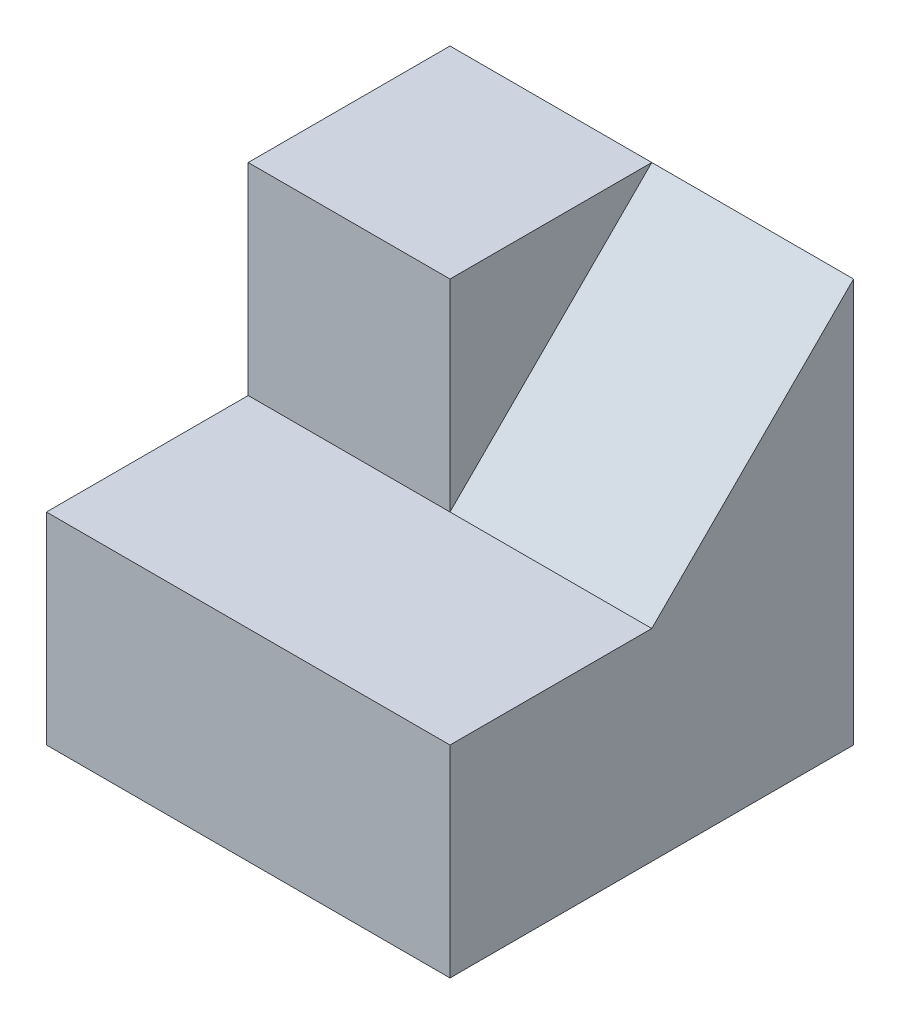
ISO-10303-21;
HEADER;
FILE_DESCRIPTION(('STEP AP214'),'2;1');
FILE_NAME('part.step','',(''),(''),'','','');
FILE_SCHEMA(('AUTOMOTIVE_DESIGN { 1 0 10303 214 1 1 1 1 }'));
ENDSEC;
DATA;
#1=APPLICATION_CONTEXT('core data for automotive mechanical design processes');
#2=APPLICATION_PROTOCOL_DEFINITION('international standard','automotive_design',2000,#1);
#3=PRODUCT_CONTEXT('',#1,'mechanical');
#4=PRODUCT('Part','Part','',(#3));
#5=PRODUCT_RELATED_PRODUCT_CATEGORY('part','',(#4));
#6=PRODUCT_DEFINITION_FORMATION('','',#4);
#7=PRODUCT_DEFINITION_CONTEXT('part definition',#1,'design');
#8=PRODUCT_DEFINITION('design','',#6,#7);
#9=PRODUCT_DEFINITION_SHAPE('','',#8);
#10=(LENGTH_UNIT() NAMED_UNIT(*) SI_UNIT(.MILLI.,.METRE.));
#11=(NAMED_UNIT(*) PLANE_ANGLE_UNIT() SI_UNIT($,.RADIAN.));
#12=(NAMED_UNIT(*) SI_UNIT($,.STERADIAN.) SOLID_ANGLE_UNIT());
#13=UNCERTAINTY_MEASURE_WITH_UNIT(LENGTH_MEASURE(1.E-05),#10,'distance_accuracy_value','');
#14=(GEOMETRIC_REPRESENTATION_CONTEXT(3) GLOBAL_UNCERTAINTY_ASSIGNED_CONTEXT((#13)) GLOBAL_UNIT_ASSIGNED_CONTEXT((#10,
#11,#12)) REPRESENTATION_CONTEXT('',''));
#15=CARTESIAN_POINT('',(0.,0.,0.));
#16=DIRECTION('',(0.,0.,1.));
#17=DIRECTION('',(1.,0.,0.));
#18=AXIS2_PLACEMENT_3D('',#15,#16,#17);
#19=CARTESIAN_POINT('',(-40.4285277484435,50.,-72.737819025522));
#20=DIRECTION('',(1.,0.,0.));
#21=DIRECTION('',(0.,0.,-1.));
#22=AXIS2_PLACEMENT_3D('',#19,#20,#21);
#23=PLANE('',#22);
#24=DIRECTION('',(0.,0.,1.));
#25=VECTOR('',#24,1.);
#26=CARTESIAN_POINT('',(-40.4285277484435,0.,-72.737819025522));
#27=LINE('',#26,#25);
#28=CARTESIAN_POINT('',(-40.4285277484435,0.,-72.737819025522));
#29=VERTEX_POINT('',#28);
#30=CARTESIAN_POINT('',(-40.4285277484435,0.,27.262180974478));
#31=VERTEX_POINT('',#30);
#32=EDGE_CURVE('E93',#29,#31,#27,.T.);
#33=ORIENTED_EDGE('',*,*,#32,.T.);
#34=DIRECTION('',(0.,-1.,0.));
#35=VECTOR('',#34,1.);
#36=CARTESIAN_POINT('',(-40.4285277484435,50.,27.262180974478));
#37=LINE('',#36,#35);
#38=CARTESIAN_POINT('',(-40.4285277484435,50.,27.262180974478));
#39=VERTEX_POINT('',#38);
#40=EDGE_CURVE('E11',#39,#31,#37,.T.);
#41=ORIENTED_EDGE('',*,*,#40,.F.);
#42=DIRECTION('',(0.,0.,1.));
#43=VECTOR('',#42,1.);
#44=CARTESIAN_POINT('',(-40.4285277484435,50.,-72.737819025522));
#45=LINE('',#44,#43);
#46=CARTESIAN_POINT('',(-40.4285277484435,50.,-22.737819025522));
#47=VERTEX_POINT('',#46);
#48=EDGE_CURVE('E86',#47,#39,#45,.T.);
#49=ORIENTED_EDGE('',*,*,#48,.F.);
#50=DIRECTION('',(0.,-1.,0.));
#51=VECTOR('',#50,1.);
#52=CARTESIAN_POINT('',(-40.4285277484435,100.,-22.737819025522));
#53=LINE('',#52,#51);
#54=CARTESIAN_POINT('',(-40.4285277484435,100.,-22.737819025522));
#55=VERTEX_POINT('',#54);
#56=EDGE_CURVE('E101',#55,#47,#53,.T.);
#57=ORIENTED_EDGE('',*,*,#56,.F.);
#58=DIRECTION('',(0.,0.,1.));
#59=VECTOR('',#58,1.);
#60=CARTESIAN_POINT('',(-40.4285277484435,100.,-72.737819025522));
#61=LINE('',#60,#59);
#62=CARTESIAN_POINT('',(-40.4285277484435,100.,-72.737819025522));
#63=VERTEX_POINT('',#62);
#64=EDGE_CURVE('E96',#63,#55,#61,.T.);
#65=ORIENTED_EDGE('',*,*,#64,.F.);
#66=DIRECTION('',(0.,-1.,0.));
#67=VECTOR('',#66,1.);
#68=CARTESIAN_POINT('',(-40.4285277484435,50.,-72.737819025522));
#69=LINE('',#68,#67);
#70=EDGE_CURVE('E78',#63,#29,#69,.T.);
#71=ORIENTED_EDGE('',*,*,#70,.T.);
#72=EDGE_LOOP('',(#33,#41,#49,#57,#65,#71));
#73=FACE_BOUND('',#72,.T.);
#74=ADVANCED_FACE('F33',(#73),#23,.F.);
#75=CARTESIAN_POINT('',(-40.4285277484435,50.,27.262180974478));
#76=DIRECTION('',(0.,0.,-1.));
#77=DIRECTION('',(-1.,0.,0.));
#78=AXIS2_PLACEMENT_3D('',#75,#76,#77);
#79=PLANE('',#78);
#80=DIRECTION('',(1.,0.,0.));
#81=VECTOR('',#80,1.);
#82=CARTESIAN_POINT('',(-40.4285277484435,0.,27.262180974478));
#83=LINE('',#82,#81);
#84=CARTESIAN_POINT('',(59.5714722515565,0.,27.262180974478));
#85=VERTEX_POINT('',#84);
#86=EDGE_CURVE('E100',#31,#85,#83,.T.);
#87=ORIENTED_EDGE('',*,*,#86,.T.);
#88=DIRECTION('',(0.,-1.,0.));
#89=VECTOR('',#88,1.);
#90=CARTESIAN_POINT('',(59.5714722515565,50.,27.262180974478));
#91=LINE('',#90,#89);
#92=CARTESIAN_POINT('',(59.5714722515565,50.,27.262180974478));
#93=VERTEX_POINT('',#92);
#94=EDGE_CURVE('E40',#93,#85,#91,.T.);
#95=ORIENTED_EDGE('',*,*,#94,.F.);
#96=DIRECTION('',(1.,0.,0.));
#97=VECTOR('',#96,1.);
#98=CARTESIAN_POINT('',(-40.4285277484435,50.,27.262180974478));
#99=LINE('',#98,#97);
#100=EDGE_CURVE('E54',#39,#93,#99,.T.);
#101=ORIENTED_EDGE('',*,*,#100,.F.);
#102=ORIENTED_EDGE('',*,*,#40,.T.);
#103=EDGE_LOOP('',(#87,#95,#101,#102));
#104=FACE_BOUND('',#103,.T.);
#105=ADVANCED_FACE('F117',(#104),#79,.F.);
#106=CARTESIAN_POINT('',(59.5714722515565,50.,-72.737819025522));
#107=DIRECTION('',(-1.,0.,0.));
#108=DIRECTION('',(0.,0.,1.));
#109=AXIS2_PLACEMENT_3D('',#106,#107,#108);
#110=PLANE('',#109);
#111=DIRECTION('',(0.,0.,-1.));
#112=VECTOR('',#111,1.);
#113=CARTESIAN_POINT('',(59.5714722515565,0.,-72.737819025522));
#114=LINE('',#113,#112);
#115=CARTESIAN_POINT('',(59.5714722515565,0.,-72.737819025522));
#116=VERTEX_POINT('',#115);
#117=EDGE_CURVE('E87',#85,#116,#114,.T.);
#118=ORIENTED_EDGE('',*,*,#117,.T.);
#119=DIRECTION('',(0.,-1.,0.));
#120=VECTOR('',#119,1.);
#121=CARTESIAN_POINT('',(59.5714722515565,50.,-72.737819025522));
#122=LINE('',#121,#120);
#123=CARTESIAN_POINT('',(59.5714722515565,100.,-72.737819025522));
#124=VERTEX_POINT('',#123);
#125=EDGE_CURVE('E82',#124,#116,#122,.T.);
#126=ORIENTED_EDGE('',*,*,#125,.F.);
#127=DIRECTION('',(0.,-0.707106781186549,0.707106781186546));
#128=VECTOR('',#127,1.);
#129=CARTESIAN_POINT('',(59.5714722515565,50.,-22.737819025522));
#130=LINE('',#129,#128);
#131=CARTESIAN_POINT('',(59.5714722515565,50.,-22.737819025522));
#132=VERTEX_POINT('',#131);
#133=EDGE_CURVE('E164',#124,#132,#130,.T.);
#134=ORIENTED_EDGE('',*,*,#133,.T.);
#135=DIRECTION('',(0.,0.,-1.));
#136=VECTOR('',#135,1.);
#137=CARTESIAN_POINT('',(59.5714722515565,50.,-72.737819025522));
#138=LINE('',#137,#136);
#139=EDGE_CURVE('E97',#93,#132,#138,.T.);
#140=ORIENTED_EDGE('',*,*,#139,.F.);
#141=ORIENTED_EDGE('',*,*,#94,.T.);
#142=EDGE_LOOP('',(#118,#126,#134,#140,#141));
#143=FACE_BOUND('',#142,.T.);
#144=ADVANCED_FACE('F114',(#143),#110,.F.);
#145=CARTESIAN_POINT('',(-40.4285277484435,50.,-72.737819025522));
#146=DIRECTION('',(0.,0.,1.));
#147=DIRECTION('',(1.,0.,0.));
#148=AXIS2_PLACEMENT_3D('',#145,#146,#147);
#149=PLANE('',#148);
#150=DIRECTION('',(-1.,0.,0.));
#151=VECTOR('',#150,1.);
#152=CARTESIAN_POINT('',(-40.4285277484435,0.,-72.737819025522));
#153=LINE('',#152,#151);
#154=EDGE_CURVE('E74',#116,#29,#153,.T.);
#155=ORIENTED_EDGE('',*,*,#154,.T.);
#156=ORIENTED_EDGE('',*,*,#70,.F.);
#157=DIRECTION('',(-1.,0.,0.));
#158=VECTOR('',#157,1.);
#159=CARTESIAN_POINT('',(-40.4285277484435,100.,-72.737819025522));
#160=LINE('',#159,#158);
#161=CARTESIAN_POINT('',(9.57147225155645,100.,-72.737819025522));
#162=VERTEX_POINT('',#161);
#163=EDGE_CURVE('E136',#162,#63,#160,.T.);
#164=ORIENTED_EDGE('',*,*,#163,.F.);
#165=DIRECTION('',(1.,0.,0.));
#166=VECTOR('',#165,1.);
#167=CARTESIAN_POINT('',(9.57147225155645,100.,-72.737819025522));
#168=LINE('',#167,#166);
#169=EDGE_CURVE('E141',#162,#124,#168,.T.);
#170=ORIENTED_EDGE('',*,*,#169,.T.);
#171=ORIENTED_EDGE('',*,*,#125,.T.);
#172=EDGE_LOOP('',(#155,#156,#164,#170,#171));
#173=FACE_BOUND('',#172,.T.);
#174=ADVANCED_FACE('F76',(#173),#149,.F.);
#175=CARTESIAN_POINT('',(0.,50.,0.));
#176=DIRECTION('',(0.,1.,0.));
#177=DIRECTION('',(0.,0.,1.));
#178=AXIS2_PLACEMENT_3D('',#175,#176,#177);
#179=PLANE('',#178);
#180=DIRECTION('',(1.,0.,0.));
#181=VECTOR('',#180,1.);
#182=CARTESIAN_POINT('',(9.57147225155646,50.,-22.737819025522));
#183=LINE('',#182,#181);
#184=CARTESIAN_POINT('',(9.57147225155646,50.,-22.737819025522));
#185=VERTEX_POINT('',#184);
#186=EDGE_CURVE('E138',#185,#132,#183,.T.);
#187=ORIENTED_EDGE('',*,*,#186,.F.);
#188=DIRECTION('',(1.,0.,0.));
#189=VECTOR('',#188,1.);
#190=CARTESIAN_POINT('',(-40.4285277484435,50.,-22.737819025522));
#191=LINE('',#190,#189);
#192=EDGE_CURVE('E47',#47,#185,#191,.T.);
#193=ORIENTED_EDGE('',*,*,#192,.F.);
#194=ORIENTED_EDGE('',*,*,#48,.T.);
#195=ORIENTED_EDGE('',*,*,#100,.T.);
#196=ORIENTED_EDGE('',*,*,#139,.T.);
#197=EDGE_LOOP('',(#187,#193,#194,#195,#196));
#198=FACE_BOUND('',#197,.T.);
#199=ADVANCED_FACE('F147',(#198),#179,.T.);
#200=CARTESIAN_POINT('',(0.,0.,0.));
#201=DIRECTION('',(0.,1.,0.));
#202=DIRECTION('',(0.,0.,1.));
#203=AXIS2_PLACEMENT_3D('',#200,#201,#202);
#204=PLANE('',#203);
#205=ORIENTED_EDGE('',*,*,#32,.F.);
#206=ORIENTED_EDGE('',*,*,#154,.F.);
#207=ORIENTED_EDGE('',*,*,#117,.F.);
#208=ORIENTED_EDGE('',*,*,#86,.F.);
#209=EDGE_LOOP('',(#205,#206,#207,#208));
#210=FACE_BOUND('',#209,.T.);
#211=ADVANCED_FACE('F99',(#210),#204,.F.);
#212=CARTESIAN_POINT('',(-40.4285277484435,100.,-22.737819025522));
#213=DIRECTION('',(0.,0.,-1.));
#214=DIRECTION('',(-1.,0.,0.));
#215=AXIS2_PLACEMENT_3D('',#212,#213,#214);
#216=PLANE('',#215);
#217=ORIENTED_EDGE('',*,*,#192,.T.);
#218=DIRECTION('',(0.,-1.,0.));
#219=VECTOR('',#218,1.);
#220=CARTESIAN_POINT('',(9.57147225155645,100.,-22.737819025522));
#221=LINE('',#220,#219);
#222=CARTESIAN_POINT('',(9.57147225155645,100.,-22.737819025522));
#223=VERTEX_POINT('',#222);
#224=EDGE_CURVE('E105',#223,#185,#221,.T.);
#225=ORIENTED_EDGE('',*,*,#224,.F.);
#226=DIRECTION('',(1.,0.,0.));
#227=VECTOR('',#226,1.);
#228=CARTESIAN_POINT('',(-40.4285277484435,100.,-22.737819025522));
#229=LINE('',#228,#227);
#230=EDGE_CURVE('E127',#55,#223,#229,.T.);
#231=ORIENTED_EDGE('',*,*,#230,.F.);
#232=ORIENTED_EDGE('',*,*,#56,.T.);
#233=EDGE_LOOP('',(#217,#225,#231,#232));
#234=FACE_BOUND('',#233,.T.);
#235=ADVANCED_FACE('F122',(#234),#216,.F.);
#236=CARTESIAN_POINT('',(9.57147225155645,100.,-72.737819025522));
#237=DIRECTION('',(-1.,0.,0.));
#238=DIRECTION('',(0.,0.,1.));
#239=AXIS2_PLACEMENT_3D('',#236,#237,#238);
#240=PLANE('',#239);
#241=ORIENTED_EDGE('',*,*,#224,.T.);
#242=DIRECTION('',(0.,-0.707106781186549,0.707106781186546));
#243=VECTOR('',#242,1.);
#244=CARTESIAN_POINT('',(9.57147225155646,50.,-22.737819025522));
#245=LINE('',#244,#243);
#246=EDGE_CURVE('E161',#162,#185,#245,.T.);
#247=ORIENTED_EDGE('',*,*,#246,.F.);
#248=DIRECTION('',(0.,0.,-1.));
#249=VECTOR('',#248,1.);
#250=CARTESIAN_POINT('',(9.57147225155645,100.,-72.737819025522));
#251=LINE('',#250,#249);
#252=EDGE_CURVE('E133',#223,#162,#251,.T.);
#253=ORIENTED_EDGE('',*,*,#252,.F.);
#254=EDGE_LOOP('',(#241,#247,#253));
#255=FACE_BOUND('',#254,.T.);
#256=ADVANCED_FACE('F167',(#255),#240,.F.);
#257=CARTESIAN_POINT('',(0.,100.,0.));
#258=DIRECTION('',(0.,1.,0.));
#259=DIRECTION('',(0.,0.,1.));
#260=AXIS2_PLACEMENT_3D('',#257,#258,#259);
#261=PLANE('',#260);
#262=ORIENTED_EDGE('',*,*,#64,.T.);
#263=ORIENTED_EDGE('',*,*,#230,.T.);
#264=ORIENTED_EDGE('',*,*,#252,.T.);
#265=ORIENTED_EDGE('',*,*,#163,.T.);
#266=EDGE_LOOP('',(#262,#263,#264,#265));
#267=FACE_BOUND('',#266,.T.);
#268=ADVANCED_FACE('F135',(#267),#261,.T.);
#269=CARTESIAN_POINT('',(9.57147225155646,50.,-22.737819025522));
#270=DIRECTION('',(0.,0.707106781186546,0.707106781186549));
#271=DIRECTION('',(0.,-0.707106781186549,0.707106781186546));
#272=AXIS2_PLACEMENT_3D('',#269,#270,#271);
#273=PLANE('',#272);
#274=ORIENTED_EDGE('',*,*,#133,.F.);
#275=ORIENTED_EDGE('',*,*,#169,.F.);
#276=ORIENTED_EDGE('',*,*,#246,.T.);
#277=ORIENTED_EDGE('',*,*,#186,.T.);
#278=EDGE_LOOP('',(#274,#275,#276,#277));
#279=FACE_BOUND('',#278,.T.);
#280=ADVANCED_FACE('F162',(#279),#273,.T.);
#281=CLOSED_SHELL('',(#74,#105,#144,#174,#199,#211,#235,#256,#268,#280));
#282=MANIFOLD_SOLID_BREP('B2',#281);
#283=ADVANCED_BREP_SHAPE_REPRESENTATION('',(#18,#282),#14);
#284=SHAPE_DEFINITION_REPRESENTATION(#9,#283);
ENDSEC;
END-ISO-10303-21;
